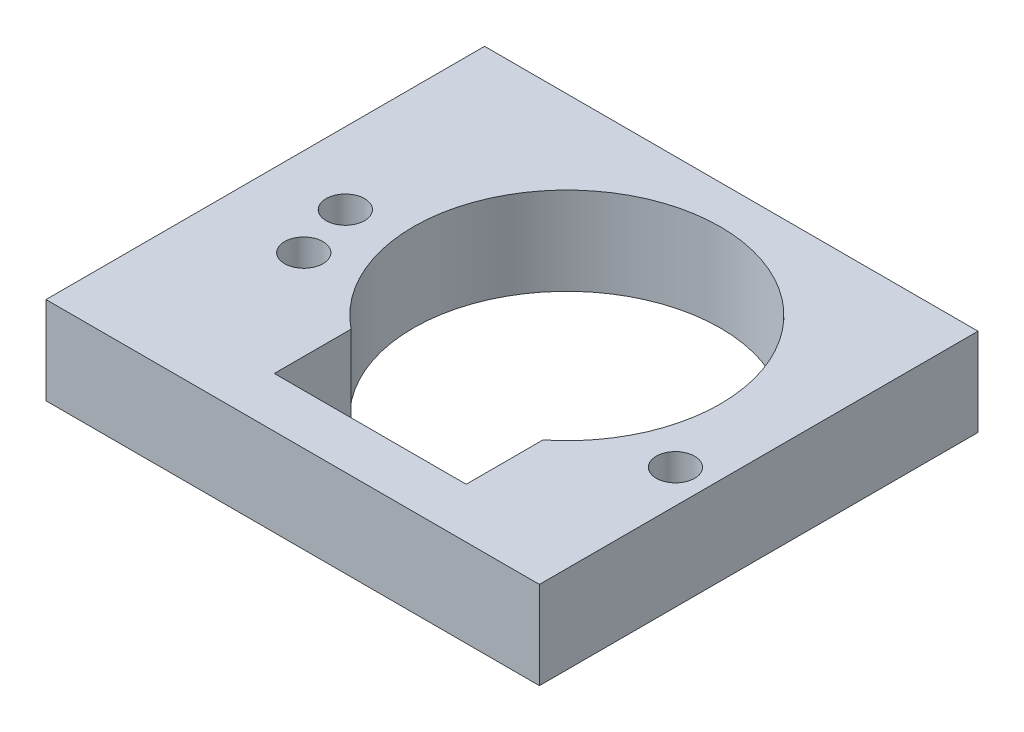
ISO-10303-21;
HEADER;
FILE_DESCRIPTION(('STEP AP214'),'2;1');
FILE_NAME('part.step','',(''),(''),'','','');
FILE_SCHEMA(('AUTOMOTIVE_DESIGN { 1 0 10303 214 1 1 1 1 }'));
ENDSEC;
DATA;
#1=APPLICATION_CONTEXT('core data for automotive mechanical design processes');
#2=APPLICATION_PROTOCOL_DEFINITION('international standard','automotive_design',2000,#1);
#3=PRODUCT_CONTEXT('',#1,'mechanical');
#4=PRODUCT('Part','Part','',(#3));
#5=PRODUCT_RELATED_PRODUCT_CATEGORY('part','',(#4));
#6=PRODUCT_DEFINITION_FORMATION('','',#4);
#7=PRODUCT_DEFINITION_CONTEXT('part definition',#1,'design');
#8=PRODUCT_DEFINITION('design','',#6,#7);
#9=PRODUCT_DEFINITION_SHAPE('','',#8);
#10=(LENGTH_UNIT() NAMED_UNIT(*) SI_UNIT(.MILLI.,.METRE.));
#11=(NAMED_UNIT(*) PLANE_ANGLE_UNIT() SI_UNIT($,.RADIAN.));
#12=(NAMED_UNIT(*) SI_UNIT($,.STERADIAN.) SOLID_ANGLE_UNIT());
#13=UNCERTAINTY_MEASURE_WITH_UNIT(LENGTH_MEASURE(1.E-05),#10,'distance_accuracy_value','');
#14=(GEOMETRIC_REPRESENTATION_CONTEXT(3) GLOBAL_UNCERTAINTY_ASSIGNED_CONTEXT((#13)) GLOBAL_UNIT_ASSIGNED_CONTEXT((#10,
#11,#12)) REPRESENTATION_CONTEXT('',''));
#15=CARTESIAN_POINT('',(0.,0.,0.));
#16=DIRECTION('',(0.,0.,1.));
#17=DIRECTION('',(1.,0.,0.));
#18=AXIS2_PLACEMENT_3D('',#15,#16,#17);
#19=CARTESIAN_POINT('',(-25.,-8.,-17.5));
#20=DIRECTION('',(-1.,0.,0.));
#21=DIRECTION('',(0.,0.,1.));
#22=AXIS2_PLACEMENT_3D('',#19,#20,#21);
#23=PLANE('',#22);
#24=DIRECTION('',(0.,0.,1.));
#25=VECTOR('',#24,1.);
#26=CARTESIAN_POINT('',(-25.,0.,-17.5));
#27=LINE('',#26,#25);
#28=CARTESIAN_POINT('',(-25.,0.,-17.5));
#29=VERTEX_POINT('',#28);
#30=CARTESIAN_POINT('',(-25.,0.,22.5));
#31=VERTEX_POINT('',#30);
#32=EDGE_CURVE('E130',#29,#31,#27,.T.);
#33=ORIENTED_EDGE('',*,*,#32,.F.);
#34=DIRECTION('',(0.,1.,0.));
#35=VECTOR('',#34,1.);
#36=CARTESIAN_POINT('',(-25.,-8.,-17.5));
#37=LINE('',#36,#35);
#38=CARTESIAN_POINT('',(-25.,-8.,-17.5));
#39=VERTEX_POINT('',#38);
#40=EDGE_CURVE('E11',#39,#29,#37,.T.);
#41=ORIENTED_EDGE('',*,*,#40,.F.);
#42=DIRECTION('',(0.,0.,1.));
#43=VECTOR('',#42,1.);
#44=CARTESIAN_POINT('',(-25.,-8.,-17.5));
#45=LINE('',#44,#43);
#46=CARTESIAN_POINT('',(-25.,-8.,22.5));
#47=VERTEX_POINT('',#46);
#48=EDGE_CURVE('E132',#39,#47,#45,.T.);
#49=ORIENTED_EDGE('',*,*,#48,.T.);
#50=DIRECTION('',(0.,1.,0.));
#51=VECTOR('',#50,1.);
#52=CARTESIAN_POINT('',(-25.,-8.,22.5));
#53=LINE('',#52,#51);
#54=EDGE_CURVE('E38',#47,#31,#53,.T.);
#55=ORIENTED_EDGE('',*,*,#54,.T.);
#56=EDGE_LOOP('',(#33,#41,#49,#55));
#57=FACE_BOUND('',#56,.T.);
#58=ADVANCED_FACE('F35',(#57),#23,.T.);
#59=CARTESIAN_POINT('',(-25.,-8.,-17.5));
#60=DIRECTION('',(0.,0.,-1.));
#61=DIRECTION('',(-1.,0.,0.));
#62=AXIS2_PLACEMENT_3D('',#59,#60,#61);
#63=PLANE('',#62);
#64=DIRECTION('',(-1.,0.,0.));
#65=VECTOR('',#64,1.);
#66=CARTESIAN_POINT('',(-25.,0.,-17.5));
#67=LINE('',#66,#65);
#68=CARTESIAN_POINT('',(20.,0.,-17.5));
#69=VERTEX_POINT('',#68);
#70=EDGE_CURVE('E136',#69,#29,#67,.T.);
#71=ORIENTED_EDGE('',*,*,#70,.F.);
#72=DIRECTION('',(0.,1.,0.));
#73=VECTOR('',#72,1.);
#74=CARTESIAN_POINT('',(20.,-8.,-17.5));
#75=LINE('',#74,#73);
#76=CARTESIAN_POINT('',(20.,-8.,-17.5));
#77=VERTEX_POINT('',#76);
#78=EDGE_CURVE('E43',#77,#69,#75,.T.);
#79=ORIENTED_EDGE('',*,*,#78,.F.);
#80=DIRECTION('',(-1.,0.,0.));
#81=VECTOR('',#80,1.);
#82=CARTESIAN_POINT('',(-25.,-8.,-17.5));
#83=LINE('',#82,#81);
#84=EDGE_CURVE('E142',#77,#39,#83,.T.);
#85=ORIENTED_EDGE('',*,*,#84,.T.);
#86=ORIENTED_EDGE('',*,*,#40,.T.);
#87=EDGE_LOOP('',(#71,#79,#85,#86));
#88=FACE_BOUND('',#87,.T.);
#89=ADVANCED_FACE('F166',(#88),#63,.T.);
#90=CARTESIAN_POINT('',(20.,-8.,-17.5));
#91=DIRECTION('',(1.,0.,0.));
#92=DIRECTION('',(0.,0.,-1.));
#93=AXIS2_PLACEMENT_3D('',#90,#91,#92);
#94=PLANE('',#93);
#95=DIRECTION('',(0.,0.,-1.));
#96=VECTOR('',#95,1.);
#97=CARTESIAN_POINT('',(20.,0.,-17.5));
#98=LINE('',#97,#96);
#99=CARTESIAN_POINT('',(20.,0.,22.5));
#100=VERTEX_POINT('',#99);
#101=EDGE_CURVE('E150',#100,#69,#98,.T.);
#102=ORIENTED_EDGE('',*,*,#101,.F.);
#103=DIRECTION('',(0.,1.,0.));
#104=VECTOR('',#103,1.);
#105=CARTESIAN_POINT('',(20.,-8.,22.5));
#106=LINE('',#105,#104);
#107=CARTESIAN_POINT('',(20.,-8.,22.5));
#108=VERTEX_POINT('',#107);
#109=EDGE_CURVE('E155',#108,#100,#106,.T.);
#110=ORIENTED_EDGE('',*,*,#109,.F.);
#111=DIRECTION('',(0.,0.,-1.));
#112=VECTOR('',#111,1.);
#113=CARTESIAN_POINT('',(20.,-8.,-17.5));
#114=LINE('',#113,#112);
#115=EDGE_CURVE('E139',#108,#77,#114,.T.);
#116=ORIENTED_EDGE('',*,*,#115,.T.);
#117=ORIENTED_EDGE('',*,*,#78,.T.);
#118=EDGE_LOOP('',(#102,#110,#116,#117));
#119=FACE_BOUND('',#118,.T.);
#120=ADVANCED_FACE('F172',(#119),#94,.T.);
#121=CARTESIAN_POINT('',(-25.,-8.,22.5));
#122=DIRECTION('',(0.,0.,1.));
#123=DIRECTION('',(1.,0.,0.));
#124=AXIS2_PLACEMENT_3D('',#121,#122,#123);
#125=PLANE('',#124);
#126=DIRECTION('',(1.,0.,0.));
#127=VECTOR('',#126,1.);
#128=CARTESIAN_POINT('',(-25.,0.,22.5));
#129=LINE('',#128,#127);
#130=EDGE_CURVE('E147',#31,#100,#129,.T.);
#131=ORIENTED_EDGE('',*,*,#130,.F.);
#132=ORIENTED_EDGE('',*,*,#54,.F.);
#133=DIRECTION('',(1.,0.,0.));
#134=VECTOR('',#133,1.);
#135=CARTESIAN_POINT('',(-25.,-8.,22.5));
#136=LINE('',#135,#134);
#137=EDGE_CURVE('E135',#47,#108,#136,.T.);
#138=ORIENTED_EDGE('',*,*,#137,.T.);
#139=ORIENTED_EDGE('',*,*,#109,.T.);
#140=EDGE_LOOP('',(#131,#132,#138,#139));
#141=FACE_BOUND('',#140,.T.);
#142=ADVANCED_FACE('F163',(#141),#125,.T.);
#143=CARTESIAN_POINT('',(0.,-8.,0.));
#144=DIRECTION('',(0.,1.,0.));
#145=DIRECTION('',(0.,0.,1.));
#146=AXIS2_PLACEMENT_3D('',#143,#144,#145);
#147=PLANE('',#146);
#148=CARTESIAN_POINT('',(-16.95,-8.,7.04150262212918));
#149=DIRECTION('',(0.,1.,0.));
#150=DIRECTION('',(0.,0.,1.));
#151=AXIS2_PLACEMENT_3D('',#148,#149,#150);
#152=CIRCLE('',#151,1.75);
#153=CARTESIAN_POINT('',(-16.95,-8.,8.79150262212918));
#154=VERTEX_POINT('',#153);
#155=EDGE_CURVE('E287',#154,#154,#152,.F.);
#156=ORIENTED_EDGE('',*,*,#155,.F.);
#157=EDGE_LOOP('',(#156));
#158=FACE_BOUND('',#157,.T.);
#159=CARTESIAN_POINT('',(16.95,-8.,7.04150262212918));
#160=DIRECTION('',(0.,1.,0.));
#161=DIRECTION('',(0.,0.,1.));
#162=AXIS2_PLACEMENT_3D('',#159,#160,#161);
#163=CIRCLE('',#162,1.75);
#164=CARTESIAN_POINT('',(16.95,-8.,8.79150262212918));
#165=VERTEX_POINT('',#164);
#166=EDGE_CURVE('E297',#165,#165,#163,.F.);
#167=ORIENTED_EDGE('',*,*,#166,.F.);
#168=EDGE_LOOP('',(#167));
#169=FACE_BOUND('',#168,.T.);
#170=CARTESIAN_POINT('',(-18.45,-8.,1.75));
#171=DIRECTION('',(0.,1.,0.));
#172=DIRECTION('',(0.,0.,1.));
#173=AXIS2_PLACEMENT_3D('',#170,#171,#172);
#174=CIRCLE('',#173,1.75);
#175=CARTESIAN_POINT('',(-18.45,-8.,3.5));
#176=VERTEX_POINT('',#175);
#177=EDGE_CURVE('E303',#176,#176,#174,.F.);
#178=ORIENTED_EDGE('',*,*,#177,.F.);
#179=EDGE_LOOP('',(#178));
#180=FACE_BOUND('',#179,.T.);
#181=DIRECTION('',(0.,0.,1.));
#182=VECTOR('',#181,1.);
#183=CARTESIAN_POINT('',(8.75,-8.,17.9287464971972));
#184=LINE('',#183,#182);
#185=CARTESIAN_POINT('',(8.75,-8.,10.9287464971972));
#186=VERTEX_POINT('',#185);
#187=CARTESIAN_POINT('',(8.75,-8.,17.9287464971972));
#188=VERTEX_POINT('',#187);
#189=EDGE_CURVE('E307',#186,#188,#184,.T.);
#190=ORIENTED_EDGE('',*,*,#189,.F.);
#191=CARTESIAN_POINT('',(0.,-8.,0.));
#192=DIRECTION('',(0.,1.,0.));
#193=DIRECTION('',(0.,0.,1.));
#194=AXIS2_PLACEMENT_3D('',#191,#192,#193);
#195=CIRCLE('',#194,14.);
#196=CARTESIAN_POINT('',(-8.75,-8.,10.9287464971972));
#197=VERTEX_POINT('',#196);
#198=EDGE_CURVE('E131',#197,#186,#195,.F.);
#199=ORIENTED_EDGE('',*,*,#198,.F.);
#200=DIRECTION('',(0.,0.,-1.));
#201=VECTOR('',#200,1.);
#202=CARTESIAN_POINT('',(-8.75,-8.,17.9287464971972));
#203=LINE('',#202,#201);
#204=CARTESIAN_POINT('',(-8.75,-8.,17.9287464971972));
#205=VERTEX_POINT('',#204);
#206=EDGE_CURVE('E128',#205,#197,#203,.T.);
#207=ORIENTED_EDGE('',*,*,#206,.F.);
#208=DIRECTION('',(-1.,0.,0.));
#209=VECTOR('',#208,1.);
#210=CARTESIAN_POINT('',(-8.75,-8.,17.9287464971972));
#211=LINE('',#210,#209);
#212=EDGE_CURVE('E106',#188,#205,#211,.T.);
#213=ORIENTED_EDGE('',*,*,#212,.F.);
#214=EDGE_LOOP('',(#190,#199,#207,#213));
#215=FACE_BOUND('',#214,.T.);
#216=ORIENTED_EDGE('',*,*,#48,.F.);
#217=ORIENTED_EDGE('',*,*,#84,.F.);
#218=ORIENTED_EDGE('',*,*,#115,.F.);
#219=ORIENTED_EDGE('',*,*,#137,.F.);
#220=EDGE_LOOP('',(#216,#217,#218,#219));
#221=FACE_BOUND('',#220,.T.);
#222=ADVANCED_FACE('F169',(#158,#169,#180,#215,#221),#147,.F.);
#223=CARTESIAN_POINT('',(0.,0.,0.));
#224=DIRECTION('',(0.,1.,0.));
#225=DIRECTION('',(0.,0.,1.));
#226=AXIS2_PLACEMENT_3D('',#223,#224,#225);
#227=PLANE('',#226);
#228=CARTESIAN_POINT('',(-16.95,0.,7.04150262212918));
#229=DIRECTION('',(0.,1.,0.));
#230=DIRECTION('',(0.,0.,1.));
#231=AXIS2_PLACEMENT_3D('',#228,#229,#230);
#232=CIRCLE('',#231,1.75);
#233=CARTESIAN_POINT('',(-16.95,0.,8.79150262212918));
#234=VERTEX_POINT('',#233);
#235=EDGE_CURVE('E290',#234,#234,#232,.T.);
#236=ORIENTED_EDGE('',*,*,#235,.F.);
#237=EDGE_LOOP('',(#236));
#238=FACE_BOUND('',#237,.T.);
#239=CARTESIAN_POINT('',(16.95,0.,7.04150262212918));
#240=DIRECTION('',(0.,1.,0.));
#241=DIRECTION('',(0.,0.,1.));
#242=AXIS2_PLACEMENT_3D('',#239,#240,#241);
#243=CIRCLE('',#242,1.75);
#244=CARTESIAN_POINT('',(16.95,0.,8.79150262212918));
#245=VERTEX_POINT('',#244);
#246=EDGE_CURVE('E292',#245,#245,#243,.T.);
#247=ORIENTED_EDGE('',*,*,#246,.F.);
#248=EDGE_LOOP('',(#247));
#249=FACE_BOUND('',#248,.T.);
#250=CARTESIAN_POINT('',(-18.45,0.,1.75));
#251=DIRECTION('',(0.,1.,0.));
#252=DIRECTION('',(0.,0.,1.));
#253=AXIS2_PLACEMENT_3D('',#250,#251,#252);
#254=CIRCLE('',#253,1.75);
#255=CARTESIAN_POINT('',(-18.45,0.,3.5));
#256=VERTEX_POINT('',#255);
#257=EDGE_CURVE('E300',#256,#256,#254,.T.);
#258=ORIENTED_EDGE('',*,*,#257,.F.);
#259=EDGE_LOOP('',(#258));
#260=FACE_BOUND('',#259,.T.);
#261=CARTESIAN_POINT('',(0.,0.,0.));
#262=DIRECTION('',(0.,1.,0.));
#263=DIRECTION('',(0.,0.,1.));
#264=AXIS2_PLACEMENT_3D('',#261,#262,#263);
#265=CIRCLE('',#264,14.);
#266=CARTESIAN_POINT('',(8.75,0.,10.9287464971972));
#267=VERTEX_POINT('',#266);
#268=CARTESIAN_POINT('',(-8.75,0.,10.9287464971972));
#269=VERTEX_POINT('',#268);
#270=EDGE_CURVE('E59',#267,#269,#265,.T.);
#271=ORIENTED_EDGE('',*,*,#270,.F.);
#272=DIRECTION('',(0.,0.,-1.));
#273=VECTOR('',#272,1.);
#274=CARTESIAN_POINT('',(8.75,0.,17.9287464971972));
#275=LINE('',#274,#273);
#276=CARTESIAN_POINT('',(8.75,0.,17.9287464971972));
#277=VERTEX_POINT('',#276);
#278=EDGE_CURVE('E119',#277,#267,#275,.T.);
#279=ORIENTED_EDGE('',*,*,#278,.F.);
#280=DIRECTION('',(1.,0.,0.));
#281=VECTOR('',#280,1.);
#282=CARTESIAN_POINT('',(-8.75,0.,17.9287464971972));
#283=LINE('',#282,#281);
#284=CARTESIAN_POINT('',(-8.75,0.,17.9287464971972));
#285=VERTEX_POINT('',#284);
#286=EDGE_CURVE('E103',#285,#277,#283,.T.);
#287=ORIENTED_EDGE('',*,*,#286,.F.);
#288=DIRECTION('',(0.,0.,1.));
#289=VECTOR('',#288,1.);
#290=CARTESIAN_POINT('',(-8.75,0.,17.9287464971972));
#291=LINE('',#290,#289);
#292=EDGE_CURVE('E112',#269,#285,#291,.T.);
#293=ORIENTED_EDGE('',*,*,#292,.F.);
#294=EDGE_LOOP('',(#271,#279,#287,#293));
#295=FACE_BOUND('',#294,.T.);
#296=ORIENTED_EDGE('',*,*,#32,.T.);
#297=ORIENTED_EDGE('',*,*,#130,.T.);
#298=ORIENTED_EDGE('',*,*,#101,.T.);
#299=ORIENTED_EDGE('',*,*,#70,.T.);
#300=EDGE_LOOP('',(#296,#297,#298,#299));
#301=FACE_BOUND('',#300,.T.);
#302=ADVANCED_FACE('F116',(#238,#249,#260,#295,#301),#227,.T.);
#303=CARTESIAN_POINT('',(0.,-50.4669854461355,0.));
#304=DIRECTION('',(0.,1.,0.));
#305=DIRECTION('',(0.,0.,1.));
#306=AXIS2_PLACEMENT_3D('',#303,#304,#305);
#307=CYLINDRICAL_SURFACE('',#306,14.);
#308=ORIENTED_EDGE('',*,*,#198,.T.);
#309=DIRECTION('',(0.,1.,0.));
#310=VECTOR('',#309,1.);
#311=CARTESIAN_POINT('',(8.75,-50.4669854461355,10.9287464971972));
#312=LINE('',#311,#310);
#313=EDGE_CURVE('E124',#186,#267,#312,.T.);
#314=ORIENTED_EDGE('',*,*,#313,.T.);
#315=ORIENTED_EDGE('',*,*,#270,.T.);
#316=DIRECTION('',(0.,1.,0.));
#317=VECTOR('',#316,1.);
#318=CARTESIAN_POINT('',(-8.75,-50.4669854461355,10.9287464971972));
#319=LINE('',#318,#317);
#320=EDGE_CURVE('E109',#197,#269,#319,.T.);
#321=ORIENTED_EDGE('',*,*,#320,.F.);
#322=EDGE_LOOP('',(#308,#314,#315,#321));
#323=FACE_BOUND('',#322,.T.);
#324=ADVANCED_FACE('F215',(#323),#307,.F.);
#325=CARTESIAN_POINT('',(8.75,-50.4669854461355,17.9287464971972));
#326=DIRECTION('',(1.,0.,0.));
#327=DIRECTION('',(0.,0.,-1.));
#328=AXIS2_PLACEMENT_3D('',#325,#326,#327);
#329=PLANE('',#328);
#330=ORIENTED_EDGE('',*,*,#189,.T.);
#331=DIRECTION('',(0.,1.,0.));
#332=VECTOR('',#331,1.);
#333=CARTESIAN_POINT('',(8.75,-50.4669854461355,17.9287464971972));
#334=LINE('',#333,#332);
#335=EDGE_CURVE('E108',#188,#277,#334,.T.);
#336=ORIENTED_EDGE('',*,*,#335,.T.);
#337=ORIENTED_EDGE('',*,*,#278,.T.);
#338=ORIENTED_EDGE('',*,*,#313,.F.);
#339=EDGE_LOOP('',(#330,#336,#337,#338));
#340=FACE_BOUND('',#339,.T.);
#341=ADVANCED_FACE('F225',(#340),#329,.F.);
#342=CARTESIAN_POINT('',(-8.75,-50.4669854461355,17.9287464971972));
#343=DIRECTION('',(0.,0.,1.));
#344=DIRECTION('',(1.,0.,0.));
#345=AXIS2_PLACEMENT_3D('',#342,#343,#344);
#346=PLANE('',#345);
#347=ORIENTED_EDGE('',*,*,#212,.T.);
#348=DIRECTION('',(0.,1.,0.));
#349=VECTOR('',#348,1.);
#350=CARTESIAN_POINT('',(-8.75,-50.4669854461355,17.9287464971972));
#351=LINE('',#350,#349);
#352=EDGE_CURVE('E51',#205,#285,#351,.T.);
#353=ORIENTED_EDGE('',*,*,#352,.T.);
#354=ORIENTED_EDGE('',*,*,#286,.T.);
#355=ORIENTED_EDGE('',*,*,#335,.F.);
#356=EDGE_LOOP('',(#347,#353,#354,#355));
#357=FACE_BOUND('',#356,.T.);
#358=ADVANCED_FACE('F100',(#357),#346,.F.);
#359=CARTESIAN_POINT('',(-8.75,-50.4669854461355,17.9287464971972));
#360=DIRECTION('',(-1.,0.,0.));
#361=DIRECTION('',(0.,0.,1.));
#362=AXIS2_PLACEMENT_3D('',#359,#360,#361);
#363=PLANE('',#362);
#364=ORIENTED_EDGE('',*,*,#206,.T.);
#365=ORIENTED_EDGE('',*,*,#320,.T.);
#366=ORIENTED_EDGE('',*,*,#292,.T.);
#367=ORIENTED_EDGE('',*,*,#352,.F.);
#368=EDGE_LOOP('',(#364,#365,#366,#367));
#369=FACE_BOUND('',#368,.T.);
#370=ADVANCED_FACE('F113',(#369),#363,.F.);
#371=CARTESIAN_POINT('',(-18.45,-50.4669854461355,1.75));
#372=DIRECTION('',(0.,1.,0.));
#373=DIRECTION('',(0.,0.,1.));
#374=AXIS2_PLACEMENT_3D('',#371,#372,#373);
#375=CYLINDRICAL_SURFACE('',#374,1.75);
#376=ORIENTED_EDGE('',*,*,#177,.T.);
#377=EDGE_LOOP('',(#376));
#378=FACE_BOUND('',#377,.T.);
#379=ORIENTED_EDGE('',*,*,#257,.T.);
#380=EDGE_LOOP('',(#379));
#381=FACE_BOUND('',#380,.T.);
#382=ADVANCED_FACE('F251',(#378,#381),#375,.F.);
#383=CARTESIAN_POINT('',(16.95,-50.4669854461355,7.04150262212918));
#384=DIRECTION('',(0.,1.,0.));
#385=DIRECTION('',(0.,0.,1.));
#386=AXIS2_PLACEMENT_3D('',#383,#384,#385);
#387=CYLINDRICAL_SURFACE('',#386,1.75);
#388=ORIENTED_EDGE('',*,*,#166,.T.);
#389=EDGE_LOOP('',(#388));
#390=FACE_BOUND('',#389,.T.);
#391=ORIENTED_EDGE('',*,*,#246,.T.);
#392=EDGE_LOOP('',(#391));
#393=FACE_BOUND('',#392,.T.);
#394=ADVANCED_FACE('F260',(#390,#393),#387,.F.);
#395=CARTESIAN_POINT('',(-16.95,-50.4669854461355,7.04150262212918));
#396=DIRECTION('',(0.,1.,0.));
#397=DIRECTION('',(0.,0.,1.));
#398=AXIS2_PLACEMENT_3D('',#395,#396,#397);
#399=CYLINDRICAL_SURFACE('',#398,1.75);
#400=ORIENTED_EDGE('',*,*,#155,.T.);
#401=EDGE_LOOP('',(#400));
#402=FACE_BOUND('',#401,.T.);
#403=ORIENTED_EDGE('',*,*,#235,.T.);
#404=EDGE_LOOP('',(#403));
#405=FACE_BOUND('',#404,.T.);
#406=ADVANCED_FACE('F270',(#402,#405),#399,.F.);
#407=CLOSED_SHELL('',(#58,#89,#120,#142,#222,#302,#324,#341,#358,#370,#382,#394,#406));
#408=MANIFOLD_SOLID_BREP('B2',#407);
#409=ADVANCED_BREP_SHAPE_REPRESENTATION('',(#18,#408),#14);
#410=SHAPE_DEFINITION_REPRESENTATION(#9,#409);
ENDSEC;
END-ISO-10303-21;
